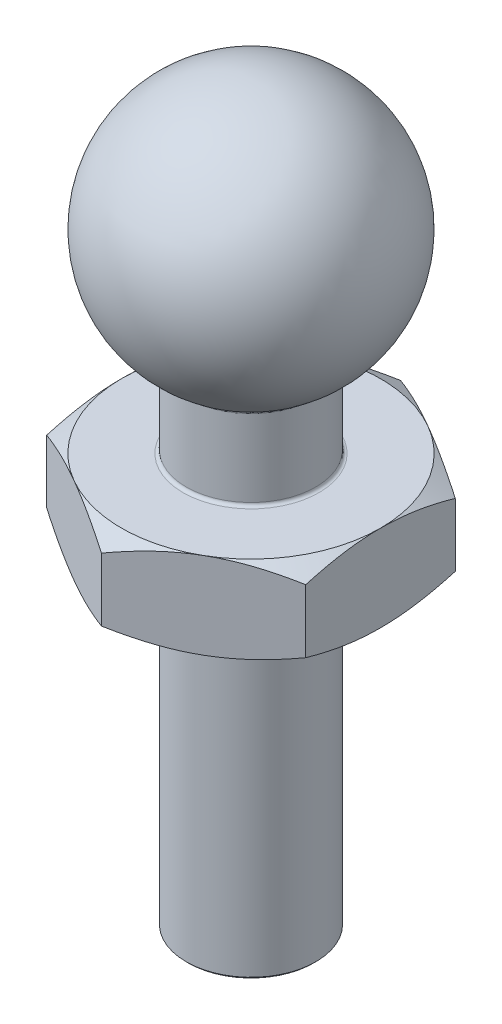
ISO-10303-21;
HEADER;
FILE_DESCRIPTION(('STEP AP214'),'2;1');
FILE_NAME('part.step','',(''),(''),'','','');
FILE_SCHEMA(('AUTOMOTIVE_DESIGN { 1 0 10303 214 1 1 1 1 }'));
ENDSEC;
DATA;
#1=APPLICATION_CONTEXT('core data for automotive mechanical design processes');
#2=APPLICATION_PROTOCOL_DEFINITION('international standard','automotive_design',2000,#1);
#3=PRODUCT_CONTEXT('',#1,'mechanical');
#4=PRODUCT('Part','Part','',(#3));
#5=PRODUCT_RELATED_PRODUCT_CATEGORY('part','',(#4));
#6=PRODUCT_DEFINITION_FORMATION('','',#4);
#7=PRODUCT_DEFINITION_CONTEXT('part definition',#1,'design');
#8=PRODUCT_DEFINITION('design','',#6,#7);
#9=PRODUCT_DEFINITION_SHAPE('','',#8);
#10=(LENGTH_UNIT() NAMED_UNIT(*) SI_UNIT(.MILLI.,.METRE.));
#11=(NAMED_UNIT(*) PLANE_ANGLE_UNIT() SI_UNIT($,.RADIAN.));
#12=(NAMED_UNIT(*) SI_UNIT($,.STERADIAN.) SOLID_ANGLE_UNIT());
#13=UNCERTAINTY_MEASURE_WITH_UNIT(LENGTH_MEASURE(1.E-05),#10,'distance_accuracy_value','');
#14=(GEOMETRIC_REPRESENTATION_CONTEXT(3) GLOBAL_UNCERTAINTY_ASSIGNED_CONTEXT((#13)) GLOBAL_UNIT_ASSIGNED_CONTEXT((#10,
#11,#12)) REPRESENTATION_CONTEXT('',''));
#15=CARTESIAN_POINT('',(0.,0.,0.));
#16=DIRECTION('',(0.,0.,1.));
#17=DIRECTION('',(1.,0.,0.));
#18=AXIS2_PLACEMENT_3D('',#15,#16,#17);
#19=CARTESIAN_POINT('',(0.,7.5,0.));
#20=DIRECTION('',(0.,1.,0.));
#21=DIRECTION('',(0.,0.,1.));
#22=AXIS2_PLACEMENT_3D('',#19,#20,#21);
#23=PLANE('',#22);
#24=CARTESIAN_POINT('',(0.,7.5,0.));
#25=DIRECTION('',(0.,1.,0.));
#26=DIRECTION('',(0.,0.,1.));
#27=AXIS2_PLACEMENT_3D('',#24,#25,#26);
#28=CIRCLE('',#27,1.5);
#29=CARTESIAN_POINT('',(0.,7.5,1.5));
#30=VERTEX_POINT('',#29);
#31=EDGE_CURVE('E323',#30,#30,#28,.T.);
#32=ORIENTED_EDGE('',*,*,#31,.T.);
#33=EDGE_LOOP('',(#32));
#34=FACE_BOUND('',#33,.T.);
#35=CARTESIAN_POINT('',(0.,7.5,0.));
#36=DIRECTION('',(0.,-1.,0.));
#37=DIRECTION('',(0.,0.,-1.));
#38=AXIS2_PLACEMENT_3D('',#35,#36,#37);
#39=CIRCLE('',#38,3.);
#40=CARTESIAN_POINT('',(3.,7.5,0.));
#41=VERTEX_POINT('',#40);
#42=CARTESIAN_POINT('',(1.5,7.5,2.59807621135332));
#43=VERTEX_POINT('',#42);
#44=EDGE_CURVE('E327',#41,#43,#39,.T.);
#45=ORIENTED_EDGE('',*,*,#44,.T.);
#46=CARTESIAN_POINT('',(-1.5,7.5,2.59807621135332));
#47=VERTEX_POINT('',#46);
#48=EDGE_CURVE('E330',#43,#47,#39,.T.);
#49=ORIENTED_EDGE('',*,*,#48,.T.);
#50=CARTESIAN_POINT('',(-3.,7.5,0.));
#51=VERTEX_POINT('',#50);
#52=EDGE_CURVE('E338',#47,#51,#39,.T.);
#53=ORIENTED_EDGE('',*,*,#52,.T.);
#54=CARTESIAN_POINT('',(-1.5,7.5,-2.59807621135332));
#55=VERTEX_POINT('',#54);
#56=EDGE_CURVE('E340',#51,#55,#39,.T.);
#57=ORIENTED_EDGE('',*,*,#56,.T.);
#58=CARTESIAN_POINT('',(1.5,7.5,-2.59807621135332));
#59=VERTEX_POINT('',#58);
#60=EDGE_CURVE('E337',#55,#59,#39,.T.);
#61=ORIENTED_EDGE('',*,*,#60,.T.);
#62=EDGE_CURVE('E262',#59,#41,#39,.T.);
#63=ORIENTED_EDGE('',*,*,#62,.T.);
#64=EDGE_LOOP('',(#45,#49,#53,#57,#61,#63));
#65=FACE_BOUND('',#64,.T.);
#66=ADVANCED_FACE('F51',(#34,#65),#23,.F.);
#67=CARTESIAN_POINT('',(0.,17.,0.));
#68=DIRECTION('',(0.,1.,0.));
#69=DIRECTION('',(0.,0.,1.));
#70=AXIS2_PLACEMENT_3D('',#67,#68,#69);
#71=CYLINDRICAL_SURFACE('',#70,1.5);
#72=CARTESIAN_POINT('',(0.,0.0500000000000014,0.));
#73=DIRECTION('',(0.,1.,0.));
#74=DIRECTION('',(0.,0.,1.));
#75=AXIS2_PLACEMENT_3D('',#72,#73,#74);
#76=CIRCLE('',#75,1.5);
#77=CARTESIAN_POINT('',(0.,0.0500000000000014,1.5));
#78=VERTEX_POINT('',#77);
#79=EDGE_CURVE('E397',#78,#78,#76,.T.);
#80=ORIENTED_EDGE('',*,*,#79,.T.);
#81=EDGE_LOOP('',(#80));
#82=FACE_BOUND('',#81,.T.);
#83=ORIENTED_EDGE('',*,*,#31,.F.);
#84=EDGE_LOOP('',(#83));
#85=FACE_BOUND('',#84,.T.);
#86=ADVANCED_FACE('F288',(#82,#85),#71,.T.);
#87=CARTESIAN_POINT('',(1.5,0.,0.));
#88=DIRECTION('',(0.,1.,0.));
#89=DIRECTION('',(0.,0.,1.));
#90=AXIS2_PLACEMENT_3D('',#87,#88,#89);
#91=PLANE('',#90);
#92=CARTESIAN_POINT('',(0.,0.,0.));
#93=DIRECTION('',(0.,1.,0.));
#94=DIRECTION('',(0.,0.,1.));
#95=AXIS2_PLACEMENT_3D('',#92,#93,#94);
#96=CIRCLE('',#95,1.45);
#97=CARTESIAN_POINT('',(0.,0.,1.45));
#98=VERTEX_POINT('',#97);
#99=EDGE_CURVE('E401',#98,#98,#96,.F.);
#100=ORIENTED_EDGE('',*,*,#99,.T.);
#101=EDGE_LOOP('',(#100));
#102=FACE_BOUND('',#101,.T.);
#103=ADVANCED_FACE('F289',(#102),#91,.F.);
#104=CARTESIAN_POINT('',(0.,0.0500000000000014,0.));
#105=DIRECTION('',(0.,1.,0.));
#106=DIRECTION('',(0.,0.,1.));
#107=AXIS2_PLACEMENT_3D('',#104,#105,#106);
#108=CONICAL_SURFACE('',#107,1.5,0.785398163397444);
#109=ORIENTED_EDGE('',*,*,#99,.F.);
#110=EDGE_LOOP('',(#109));
#111=FACE_BOUND('',#110,.T.);
#112=ORIENTED_EDGE('',*,*,#79,.F.);
#113=EDGE_LOOP('',(#112));
#114=FACE_BOUND('',#113,.T.);
#115=ADVANCED_FACE('F292',(#111,#114),#108,.T.);
#116=CARTESIAN_POINT('',(0.,7.5,0.));
#117=DIRECTION('',(0.,1.,0.));
#118=DIRECTION('',(0.,0.,-1.));
#119=AXIS2_PLACEMENT_3D('',#116,#117,#118);
#120=CONICAL_SURFACE('',#119,3.,1.0471975511966);
#121=CARTESIAN_POINT('',(0.000200000000000398,7.76801586243101,3.46421708519159));
#122=CARTESIAN_POINT('',(-0.131635206588331,7.72405370445231,3.38810199317915));
#123=CARTESIAN_POINT('',(-0.264608405355249,7.68407158629263,3.31132988107606));
#124=CARTESIAN_POINT('',(-0.532857420002055,7.61428208044547,3.15645624025988));
#125=CARTESIAN_POINT('',(-0.668138002634341,7.58449938226538,3.078351959461));
#126=CARTESIAN_POINT('',(-0.937022602096483,7.53813783921126,2.92311136358059));
#127=CARTESIAN_POINT('',(-1.07058524542946,7.52125044112295,2.84599893549861));
#128=CARTESIAN_POINT('',(-1.33833905729569,7.50108964244852,2.6914112001411));
#129=CARTESIAN_POINT('',(-1.47252925247984,7.49779954778108,2.61393645482892));
#130=CARTESIAN_POINT('',(-1.72327559769581,7.50464053088539,2.46916798492017));
#131=CARTESIAN_POINT('',(-1.83986926497268,7.51309191419262,2.40185259973206));
#132=CARTESIAN_POINT('',(-2.07229698497464,7.53987894300704,2.2676603930218));
#133=CARTESIAN_POINT('',(-2.18813023365133,7.55822374086171,2.2007840357172));
#134=CARTESIAN_POINT('',(-2.42103725705637,7.60408475085333,2.06631510305815));
#135=CARTESIAN_POINT('',(-2.53808155051394,7.63179538526308,1.99873954872331));
#136=CARTESIAN_POINT('',(-2.77042435049912,7.6946877951374,1.86459637060759));
#137=CARTESIAN_POINT('',(-2.88572583417111,7.72985479102156,1.79802702797161));
#138=CARTESIAN_POINT('',(-3.0002,7.76801586243101,1.73193533751504));
#139=B_SPLINE_CURVE_WITH_KNOTS('',3,(#121,#122,#123,#124,#125,#126,#127,#128,#129,#130,#131,
#132,#133,#134,#135,#136,#137,#138),.UNSPECIFIED.,.F.,.F.,(4,2,2,2,2,2,2,2,4),(0.,
0.475539830103041,0.952222784107964,1.41710776961288,1.88142182298026,2.28572436316091,
2.69040156475039,3.10405572063576,3.5168974940707),.UNSPECIFIED.);
#140=CARTESIAN_POINT('',(0.,7.76794919243112,3.46410161513776));
#141=VERTEX_POINT('',#140);
#142=EDGE_CURVE('E253',#141,#47,#139,.T.);
#143=ORIENTED_EDGE('',*,*,#142,.T.);
#144=ORIENTED_EDGE('',*,*,#48,.F.);
#145=CARTESIAN_POINT('',(3.0002,7.76801586243101,1.73193533751504));
#146=CARTESIAN_POINT('',(2.86836479341167,7.72405370445231,1.80805042952748));
#147=CARTESIAN_POINT('',(2.73539159464475,7.68407158629263,1.88482254163057));
#148=CARTESIAN_POINT('',(2.46714257999794,7.61428208044547,2.03969618244675));
#149=CARTESIAN_POINT('',(2.33186199736566,7.58449938226538,2.11780046324563));
#150=CARTESIAN_POINT('',(2.06297739790352,7.53813783921126,2.27304105912605));
#151=CARTESIAN_POINT('',(1.92941475457054,7.52125044112295,2.35015348720802));
#152=CARTESIAN_POINT('',(1.66166094270431,7.50108964244852,2.50474122256554));
#153=CARTESIAN_POINT('',(1.52747074752016,7.49779954778108,2.58221596787771));
#154=CARTESIAN_POINT('',(1.27672440230419,7.50464053088539,2.72698443778647));
#155=CARTESIAN_POINT('',(1.16013073502732,7.51309191419262,2.79429982297457));
#156=CARTESIAN_POINT('',(0.927703015025364,7.53987894300704,2.92849202968483));
#157=CARTESIAN_POINT('',(0.81186976634867,7.55822374086171,2.99536838698943));
#158=CARTESIAN_POINT('',(0.578962742943633,7.60408475085333,3.12983731964849));
#159=CARTESIAN_POINT('',(0.46191844948606,7.63179538526308,3.19741287398332));
#160=CARTESIAN_POINT('',(0.229575649500875,7.6946877951374,3.33155605209904));
#161=CARTESIAN_POINT('',(0.114274165828894,7.72985479102156,3.39812539473502));
#162=CARTESIAN_POINT('',(-0.000199999999999877,7.76801586243101,3.46421708519159));
#163=B_SPLINE_CURVE_WITH_KNOTS('',3,(#145,#146,#147,#148,#149,#150,#151,#152,#153,#154,#155,
#156,#157,#158,#159,#160,#161,#162),.UNSPECIFIED.,.F.,.F.,(4,2,2,2,2,2,2,2,4),(0.,
0.47553983010304,0.952222784107964,1.41710776961288,1.88142182298026,2.28572436316091,
2.69040156475039,3.10405572063576,3.5168974940707),.UNSPECIFIED.);
#164=EDGE_CURVE('E404',#43,#141,#163,.T.);
#165=ORIENTED_EDGE('',*,*,#164,.T.);
#166=EDGE_LOOP('',(#143,#144,#165));
#167=FACE_BOUND('',#166,.T.);
#168=ADVANCED_FACE('F301',(#167),#120,.T.);
#169=CARTESIAN_POINT('',(3.,9.50330724402733,-5.73225080756888));
#170=CARTESIAN_POINT('',(3.,9.43464237126105,-5.59799811373669));
#171=CARTESIAN_POINT('',(3.,9.36637341925044,-5.46354106552017));
#172=CARTESIAN_POINT('',(3.,9.2308248022497,-5.19412594711895));
#173=CARTESIAN_POINT('',(3.,9.16354515832403,-5.05916786634262));
#174=CARTESIAN_POINT('',(3.,9.03006127591258,-4.78843231789163));
#175=CARTESIAN_POINT('',(3.,8.9638590776609,-4.65265384244874));
#176=CARTESIAN_POINT('',(3.,8.83291944474628,-4.38038885038151));
#177=CARTESIAN_POINT('',(3.,8.76818203148001,-4.24390232345014));
#178=CARTESIAN_POINT('',(3.,8.63726924760924,-3.96310511366176));
#179=CARTESIAN_POINT('',(3.,8.57118867268844,-3.81875010473635));
#180=CARTESIAN_POINT('',(3.,8.44157071272035,-3.52890389215656));
#181=CARTESIAN_POINT('',(3.,8.37803325458598,-3.38341272129836));
#182=CARTESIAN_POINT('',(3.,8.25426481523107,-3.09114280320249));
#183=CARTESIAN_POINT('',(3.,8.19403155172058,-2.94436502804428));
#184=CARTESIAN_POINT('',(3.,8.07778705413149,-2.64909731827644));
#185=CARTESIAN_POINT('',(3.,8.02177685319141,-2.50060697487877));
#186=CARTESIAN_POINT('',(3.,7.90579651393534,-2.17495473766773));
#187=CARTESIAN_POINT('',(3.,7.84690225188754,-1.99740334689548));
#188=CARTESIAN_POINT('',(3.,7.73970476580994,-1.63917764376158));
#189=CARTESIAN_POINT('',(3.,7.69139595385541,-1.45850503366086));
#190=CARTESIAN_POINT('',(3.,7.60976736720391,-1.09720914532956));
#191=CARTESIAN_POINT('',(3.,7.57618522306302,-0.916647599895755));
#192=CARTESIAN_POINT('',(3.,7.53873257823308,-0.644079261802785));
#193=CARTESIAN_POINT('',(3.,7.52840212622122,-0.552943422867092));
#194=CARTESIAN_POINT('',(3.,7.51236545399948,-0.370270654947725));
#195=CARTESIAN_POINT('',(3.,7.50665855920199,-0.278733786435307));
#196=CARTESIAN_POINT('',(3.,7.50003385145738,-0.0944078517722065));
#197=CARTESIAN_POINT('',(3.,7.49917313836561,-0.00161671746075821));
#198=CARTESIAN_POINT('',(3.,7.50242474437203,0.183877598413802));
#199=CARTESIAN_POINT('',(3.,7.50653707980771,0.27658077968697));
#200=CARTESIAN_POINT('',(3.,7.51958629232832,0.461668088480516));
#201=CARTESIAN_POINT('',(3.,7.52852441288393,0.554052127589445));
#202=CARTESIAN_POINT('',(3.,7.5509180164693,0.738276464049775));
#203=CARTESIAN_POINT('',(3.,7.56437421254375,0.830116673244045));
#204=CARTESIAN_POINT('',(3.,7.61151321654347,1.1081241349506));
#205=CARTESIAN_POINT('',(3.,7.65168916483078,1.29320289274649));
#206=CARTESIAN_POINT('',(3.,7.74516695908608,1.65992833453579));
#207=CARTESIAN_POINT('',(3.,7.7984718251831,1.8415742184766));
#208=CARTESIAN_POINT('',(3.,7.90998517829698,2.18718321983853));
#209=CARTESIAN_POINT('',(3.,7.96745039113262,2.35139002090274));
#210=CARTESIAN_POINT('',(3.,8.08842229406423,2.67757637701536));
#211=CARTESIAN_POINT('',(3.,8.15193017789617,2.83955548471668));
#212=CARTESIAN_POINT('',(3.,8.28350331004152,3.16180541641892));
#213=CARTESIAN_POINT('',(3.,8.35157253601678,3.32207460435457));
#214=CARTESIAN_POINT('',(3.,8.49111835327863,3.64112437712565));
#215=CARTESIAN_POINT('',(3.,8.56259510919257,3.79990488959462));
#216=CARTESIAN_POINT('',(3.,8.70427958485193,4.10783154121877));
#217=CARTESIAN_POINT('',(3.,8.77435195699988,4.25704019529893));
#218=CARTESIAN_POINT('',(3.,8.9163448127077,4.55457880885657));
#219=CARTESIAN_POINT('',(3.,8.98826534808616,4.70290874355283));
#220=CARTESIAN_POINT('',(3.,9.1333691427572,4.99841900754648));
#221=CARTESIAN_POINT('',(3.,9.20654817764491,5.14560141584992));
#222=CARTESIAN_POINT('',(3.,9.35409847057374,5.43935321353677));
#223=CARTESIAN_POINT('',(3.,9.42846963344796,5.58592265068707));
#224=CARTESIAN_POINT('',(3.,9.50330724402733,5.73225080756888));
#225=B_SPLINE_CURVE_WITH_KNOTS('',3,(#169,#170,#171,#172,#173,#174,#175,#176,#177,#178,#179,
#180,#181,#182,#183,#184,#185,#186,#187,#188,#189,#190,#191,#192,#193,#194,#195,#196,#197,#198,
#199,#200,#201,#202,#203,#204,#205,#206,#207,#208,#209,#210,#211,#212,#213,#214,#215,#216,#217,
#218,#219,#220,#221,#222,#223,#224),.UNSPECIFIED.,.F.,.F.,(4,2,2,2,2,2,2,2,2,2,2,2,2,2,2,2,2,2,
2,2,2,2,2,2,2,2,2,4),(0.,0.452382016001321,0.904773650265349,1.35794045354517,1.81111387213612,
2.2873771437625,2.76362671813268,3.23954308217786,3.71557550010852,4.27652369616462,
4.83717505756687,5.38738613645124,5.66244417939779,5.937462083513,6.21571369559986,
6.4939662218021,6.77229048018743,7.05065868449287,7.61810965270507,8.18569127741243,
8.70745206667821,9.2293161451901,9.75164138486645,10.2739918851653,10.7685068932809,
11.2630357817083,11.756143015984,12.2492110799155),.UNSPECIFIED.);
#226=CARTESIAN_POINT('',(3.,7.76794919243112,1.73205080756888));
#227=VERTEX_POINT('',#226);
#228=EDGE_CURVE('E261',#41,#227,#225,.T.);
#229=ORIENTED_EDGE('',*,*,#228,.T.);
#230=EDGE_CURVE('E411',#227,#43,#163,.T.);
#231=ORIENTED_EDGE('',*,*,#230,.T.);
#232=ORIENTED_EDGE('',*,*,#44,.F.);
#233=EDGE_LOOP('',(#229,#231,#232));
#234=FACE_BOUND('',#233,.T.);
#235=ADVANCED_FACE('F501',(#234),#120,.T.);
#236=CARTESIAN_POINT('',(-3.,9.50330724402733,5.73225080756888));
#237=CARTESIAN_POINT('',(-3.,9.43464237126105,5.59799811373669));
#238=CARTESIAN_POINT('',(-3.,9.36637341925044,5.46354106552017));
#239=CARTESIAN_POINT('',(-3.,9.2308248022497,5.19412594711895));
#240=CARTESIAN_POINT('',(-3.,9.16354515832403,5.05916786634262));
#241=CARTESIAN_POINT('',(-3.,9.03006127591258,4.78843231789163));
#242=CARTESIAN_POINT('',(-3.,8.9638590776609,4.65265384244874));
#243=CARTESIAN_POINT('',(-3.,8.83291944474628,4.38038885038151));
#244=CARTESIAN_POINT('',(-3.,8.76818203148001,4.24390232345014));
#245=CARTESIAN_POINT('',(-3.,8.63726924760924,3.96310511366176));
#246=CARTESIAN_POINT('',(-3.,8.57118867268844,3.81875010473635));
#247=CARTESIAN_POINT('',(-3.,8.44157071272035,3.52890389215656));
#248=CARTESIAN_POINT('',(-3.,8.37803325458598,3.38341272129836));
#249=CARTESIAN_POINT('',(-3.,8.25426481523107,3.0911428032025));
#250=CARTESIAN_POINT('',(-3.,8.19403155172058,2.94436502804428));
#251=CARTESIAN_POINT('',(-3.,8.07778705413149,2.64909731827644));
#252=CARTESIAN_POINT('',(-3.,8.02177685319141,2.50060697487877));
#253=CARTESIAN_POINT('',(-3.,7.90579651393534,2.17495473766773));
#254=CARTESIAN_POINT('',(-3.,7.84690225188754,1.99740334689548));
#255=CARTESIAN_POINT('',(-3.,7.73970476580994,1.63917764376158));
#256=CARTESIAN_POINT('',(-3.,7.69139595385541,1.45850503366086));
#257=CARTESIAN_POINT('',(-3.,7.60976736720391,1.09720914532956));
#258=CARTESIAN_POINT('',(-3.,7.57618522306302,0.916647599895757));
#259=CARTESIAN_POINT('',(-3.,7.53873257823308,0.644079261802787));
#260=CARTESIAN_POINT('',(-3.,7.52840212622122,0.552943422867095));
#261=CARTESIAN_POINT('',(-3.,7.51236545399948,0.370270654947728));
#262=CARTESIAN_POINT('',(-3.,7.50665855920199,0.27873378643531));
#263=CARTESIAN_POINT('',(-3.,7.50003385145738,0.0944078517722089));
#264=CARTESIAN_POINT('',(-3.,7.4991731383656,0.0016167174607605));
#265=CARTESIAN_POINT('',(-3.,7.50242474437203,-0.1838775984138));
#266=CARTESIAN_POINT('',(-3.,7.50653707980771,-0.276580779686967));
#267=CARTESIAN_POINT('',(-3.,7.51958629232832,-0.461668088480514));
#268=CARTESIAN_POINT('',(-3.,7.52852441288393,-0.554052127589442));
#269=CARTESIAN_POINT('',(-3.,7.5509180164693,-0.738276464049773));
#270=CARTESIAN_POINT('',(-3.,7.56437421254374,-0.830116673244042));
#271=CARTESIAN_POINT('',(-3.,7.61151321654347,-1.1081241349506));
#272=CARTESIAN_POINT('',(-3.,7.65168916483078,-1.29320289274649));
#273=CARTESIAN_POINT('',(-3.,7.74516695908608,-1.65992833453579));
#274=CARTESIAN_POINT('',(-3.,7.79847182518309,-1.8415742184766));
#275=CARTESIAN_POINT('',(-3.,7.90998517829698,-2.18718321983853));
#276=CARTESIAN_POINT('',(-3.,7.96745039113261,-2.35139002090273));
#277=CARTESIAN_POINT('',(-3.,8.08842229406423,-2.67757637701535));
#278=CARTESIAN_POINT('',(-3.,8.15193017789617,-2.83955548471668));
#279=CARTESIAN_POINT('',(-3.,8.28350331004152,-3.16180541641892));
#280=CARTESIAN_POINT('',(-3.,8.35157253601677,-3.32207460435457));
#281=CARTESIAN_POINT('',(-3.,8.49111835327863,-3.64112437712565));
#282=CARTESIAN_POINT('',(-3.,8.56259510919257,-3.79990488959461));
#283=CARTESIAN_POINT('',(-3.,8.70427958485193,-4.10783154121876));
#284=CARTESIAN_POINT('',(-3.,8.77435195699987,-4.25704019529893));
#285=CARTESIAN_POINT('',(-3.,8.9163448127077,-4.55457880885657));
#286=CARTESIAN_POINT('',(-3.,8.98826534808615,-4.70290874355283));
#287=CARTESIAN_POINT('',(-3.,9.13336914275719,-4.99841900754647));
#288=CARTESIAN_POINT('',(-3.,9.20654817764491,-5.14560141584992));
#289=CARTESIAN_POINT('',(-3.,9.35409847057374,-5.43935321353677));
#290=CARTESIAN_POINT('',(-3.,9.42846963344796,-5.58592265068707));
#291=CARTESIAN_POINT('',(-3.,9.50330724402733,-5.73225080756888));
#292=B_SPLINE_CURVE_WITH_KNOTS('',3,(#236,#237,#238,#239,#240,#241,#242,#243,#244,#245,#246,
#247,#248,#249,#250,#251,#252,#253,#254,#255,#256,#257,#258,#259,#260,#261,#262,#263,#264,#265,
#266,#267,#268,#269,#270,#271,#272,#273,#274,#275,#276,#277,#278,#279,#280,#281,#282,#283,#284,
#285,#286,#287,#288,#289,#290,#291),.UNSPECIFIED.,.F.,.F.,(4,2,2,2,2,2,2,2,2,2,2,2,2,2,2,2,2,2,
2,2,2,2,2,2,2,2,2,4),(0.,0.452382016001322,0.90477365026535,1.35794045354517,1.81111387213612,
2.2873771437625,2.76362671813267,3.23954308217786,3.71557550010852,4.27652369616461,
4.83717505756687,5.38738613645124,5.66244417939778,5.937462083513,6.21571369559986,
6.4939662218021,6.77229048018743,7.05065868449287,7.61810965270507,8.18569127741243,
8.70745206667821,9.22931614519009,9.75164138486645,10.2739918851653,10.7685068932809,
11.2630357817083,11.756143015984,12.2492110799155),.UNSPECIFIED.);
#293=CARTESIAN_POINT('',(-3.,7.76794919243112,1.73205080756888));
#294=VERTEX_POINT('',#293);
#295=EDGE_CURVE('E272',#294,#51,#292,.T.);
#296=ORIENTED_EDGE('',*,*,#295,.T.);
#297=ORIENTED_EDGE('',*,*,#52,.F.);
#298=EDGE_CURVE('E263',#47,#294,#139,.T.);
#299=ORIENTED_EDGE('',*,*,#298,.T.);
#300=EDGE_LOOP('',(#296,#297,#299));
#301=FACE_BOUND('',#300,.T.);
#302=ADVANCED_FACE('F483',(#301),#120,.T.);
#303=CARTESIAN_POINT('',(-3.0002,7.76801586243101,-1.73193533751504));
#304=CARTESIAN_POINT('',(-2.86836479341167,7.7240537044523,-1.80805042952748));
#305=CARTESIAN_POINT('',(-2.73539159464475,7.68407158629263,-1.88482254163057));
#306=CARTESIAN_POINT('',(-2.46714257999794,7.61428208044546,-2.03969618244675));
#307=CARTESIAN_POINT('',(-2.33186199736566,7.58449938226538,-2.11780046324563));
#308=CARTESIAN_POINT('',(-2.06297739790352,7.53813783921126,-2.27304105912605));
#309=CARTESIAN_POINT('',(-1.92941475457054,7.52125044112295,-2.35015348720802));
#310=CARTESIAN_POINT('',(-1.66166094270431,7.50108964244852,-2.50474122256553));
#311=CARTESIAN_POINT('',(-1.52747074752016,7.49779954778108,-2.58221596787771));
#312=CARTESIAN_POINT('',(-1.27672440230419,7.50464053088539,-2.72698443778646));
#313=CARTESIAN_POINT('',(-1.16013073502732,7.51309191419262,-2.79429982297457));
#314=CARTESIAN_POINT('',(-0.927703015025363,7.53987894300703,-2.92849202968483));
#315=CARTESIAN_POINT('',(-0.811869766348669,7.55822374086171,-2.99536838698943));
#316=CARTESIAN_POINT('',(-0.578962742943632,7.60408475085333,-3.12983731964848));
#317=CARTESIAN_POINT('',(-0.461918449486059,7.63179538526308,-3.19741287398332));
#318=CARTESIAN_POINT('',(-0.229575649500874,7.6946877951374,-3.33155605209904));
#319=CARTESIAN_POINT('',(-0.114274165828893,7.72985479102156,-3.39812539473502));
#320=CARTESIAN_POINT('',(0.000200000000001287,7.76801586243101,-3.46421708519159));
#321=B_SPLINE_CURVE_WITH_KNOTS('',3,(#303,#304,#305,#306,#307,#308,#309,#310,#311,#312,#313,
#314,#315,#316,#317,#318,#319,#320),.UNSPECIFIED.,.F.,.F.,(4,2,2,2,2,2,2,2,4),(0.,
0.475539830103041,0.952222784107964,1.41710776961288,1.88142182298026,2.28572436316091,
2.69040156475039,3.10405572063576,3.5168974940707),.UNSPECIFIED.);
#322=CARTESIAN_POINT('',(-3.,7.7679491924311,-1.73205080756891));
#323=VERTEX_POINT('',#322);
#324=EDGE_CURVE('E381',#323,#55,#321,.T.);
#325=ORIENTED_EDGE('',*,*,#324,.T.);
#326=ORIENTED_EDGE('',*,*,#56,.F.);
#327=EDGE_CURVE('E443',#51,#323,#292,.T.);
#328=ORIENTED_EDGE('',*,*,#327,.T.);
#329=EDGE_LOOP('',(#325,#326,#328));
#330=FACE_BOUND('',#329,.T.);
#331=ADVANCED_FACE('F201',(#330),#120,.T.);
#332=CARTESIAN_POINT('',(0.,7.76794919243112,-3.46410161513775));
#333=VERTEX_POINT('',#332);
#334=EDGE_CURVE('E450',#55,#333,#321,.T.);
#335=ORIENTED_EDGE('',*,*,#334,.T.);
#336=CARTESIAN_POINT('',(-0.00019999999999887,7.76801586243101,-3.46421708519159));
#337=CARTESIAN_POINT('',(0.131635206588333,7.7240537044523,-3.38810199317915));
#338=CARTESIAN_POINT('',(0.26460840535525,7.68407158629263,-3.31132988107606));
#339=CARTESIAN_POINT('',(0.532857420002057,7.61428208044547,-3.15645624025988));
#340=CARTESIAN_POINT('',(0.668138002634342,7.58449938226538,-3.078351959461));
#341=CARTESIAN_POINT('',(0.937022602096484,7.53813783921126,-2.92311136358059));
#342=CARTESIAN_POINT('',(1.07058524542946,7.52125044112295,-2.84599893549861));
#343=CARTESIAN_POINT('',(1.33833905729569,7.50108964244852,-2.6914112001411));
#344=CARTESIAN_POINT('',(1.47252925247984,7.49779954778108,-2.61393645482892));
#345=CARTESIAN_POINT('',(1.72327559769581,7.50464053088539,-2.46916798492017));
#346=CARTESIAN_POINT('',(1.83986926497268,7.51309191419262,-2.40185259973206));
#347=CARTESIAN_POINT('',(2.07229698497464,7.53987894300703,-2.2676603930218));
#348=CARTESIAN_POINT('',(2.18813023365133,7.55822374086171,-2.2007840357172));
#349=CARTESIAN_POINT('',(2.42103725705637,7.60408475085333,-2.06631510305815));
#350=CARTESIAN_POINT('',(2.53808155051394,7.63179538526308,-1.99873954872331));
#351=CARTESIAN_POINT('',(2.77042435049913,7.6946877951374,-1.86459637060759));
#352=CARTESIAN_POINT('',(2.88572583417111,7.72985479102156,-1.79802702797161));
#353=CARTESIAN_POINT('',(3.0002,7.76801586243101,-1.73193533751504));
#354=B_SPLINE_CURVE_WITH_KNOTS('',3,(#336,#337,#338,#339,#340,#341,#342,#343,#344,#345,#346,
#347,#348,#349,#350,#351,#352,#353),.UNSPECIFIED.,.F.,.F.,(4,2,2,2,2,2,2,2,4),(0.,
0.475539830103041,0.952222784107964,1.41710776961288,1.88142182298026,2.28572436316091,
2.69040156475039,3.10405572063576,3.5168974940707),.UNSPECIFIED.);
#355=EDGE_CURVE('E440',#333,#59,#354,.T.);
#356=ORIENTED_EDGE('',*,*,#355,.T.);
#357=ORIENTED_EDGE('',*,*,#60,.F.);
#358=EDGE_LOOP('',(#335,#356,#357));
#359=FACE_BOUND('',#358,.T.);
#360=ADVANCED_FACE('F482',(#359),#120,.T.);
#361=CARTESIAN_POINT('',(3.,7.76794919243112,-1.73205080756888));
#362=VERTEX_POINT('',#361);
#363=EDGE_CURVE('E435',#59,#362,#354,.T.);
#364=ORIENTED_EDGE('',*,*,#363,.T.);
#365=EDGE_CURVE('E271',#362,#41,#225,.T.);
#366=ORIENTED_EDGE('',*,*,#365,.T.);
#367=ORIENTED_EDGE('',*,*,#62,.F.);
#368=EDGE_LOOP('',(#364,#366,#367));
#369=FACE_BOUND('',#368,.T.);
#370=ADVANCED_FACE('F437',(#369),#120,.T.);
#371=CARTESIAN_POINT('',(0.,9.5,3.46410161513776));
#372=DIRECTION('',(-0.5,0.,-0.866025403784439));
#373=DIRECTION('',(-0.866025403784439,0.,0.5));
#374=AXIS2_PLACEMENT_3D('',#371,#372,#373);
#375=PLANE('',#374);
#376=DIRECTION('',(0.,-1.,0.));
#377=VECTOR('',#376,1.);
#378=CARTESIAN_POINT('',(3.,9.5,1.73205080756888));
#379=LINE('',#378,#377);
#380=CARTESIAN_POINT('',(3.,9.23205080756888,1.73205080756888));
#381=VERTEX_POINT('',#380);
#382=EDGE_CURVE('E457',#381,#227,#379,.T.);
#383=ORIENTED_EDGE('',*,*,#382,.F.);
#384=CARTESIAN_POINT('',(3.0002,9.23198413756899,1.73193533751504));
#385=CARTESIAN_POINT('',(2.86836479341167,9.27594629554769,1.80805042952748));
#386=CARTESIAN_POINT('',(2.73539159464475,9.31592841370737,1.88482254163057));
#387=CARTESIAN_POINT('',(2.46714257999794,9.38571791955454,2.03969618244675));
#388=CARTESIAN_POINT('',(2.33186199736566,9.41550061773462,2.11780046324563));
#389=CARTESIAN_POINT('',(2.06297739790352,9.46186216078875,2.27304105912605));
#390=CARTESIAN_POINT('',(1.92941475457054,9.47874955887705,2.35015348720802));
#391=CARTESIAN_POINT('',(1.66166094270431,9.49891035755148,2.50474122256554));
#392=CARTESIAN_POINT('',(1.52747074752016,9.50220045221892,2.58221596787771));
#393=CARTESIAN_POINT('',(1.27672440230419,9.49535946911461,2.72698443778647));
#394=CARTESIAN_POINT('',(1.16013073502732,9.48690808580738,2.79429982297457));
#395=CARTESIAN_POINT('',(0.927703015025364,9.46012105699297,2.92849202968483));
#396=CARTESIAN_POINT('',(0.811869766348669,9.44177625913829,2.99536838698943));
#397=CARTESIAN_POINT('',(0.578962742943633,9.39591524914667,3.12983731964849));
#398=CARTESIAN_POINT('',(0.46191844948606,9.36820461473692,3.19741287398332));
#399=CARTESIAN_POINT('',(0.229575649500876,9.3053122048626,3.33155605209904));
#400=CARTESIAN_POINT('',(0.114274165828894,9.27014520897845,3.39812539473502));
#401=CARTESIAN_POINT('',(-0.000199999999999755,9.23198413756899,3.46421708519159));
#402=B_SPLINE_CURVE_WITH_KNOTS('',3,(#384,#385,#386,#387,#388,#389,#390,#391,#392,#393,#394,
#395,#396,#397,#398,#399,#400,#401),.UNSPECIFIED.,.F.,.F.,(4,2,2,2,2,2,2,2,4),(0.,
0.475539830103041,0.952222784107964,1.41710776961288,1.88142182298026,2.28572436316091,
2.69040156475039,3.10405572063576,3.5168974940707),.UNSPECIFIED.);
#403=CARTESIAN_POINT('',(1.5,9.5,2.59807621135332));
#404=VERTEX_POINT('',#403);
#405=EDGE_CURVE('E67',#381,#404,#402,.T.);
#406=ORIENTED_EDGE('',*,*,#405,.T.);
#407=CARTESIAN_POINT('',(0.,9.23205080756888,3.46410161513776));
#408=VERTEX_POINT('',#407);
#409=EDGE_CURVE('E235',#404,#408,#402,.T.);
#410=ORIENTED_EDGE('',*,*,#409,.T.);
#411=DIRECTION('',(0.,-1.,0.));
#412=VECTOR('',#411,1.);
#413=CARTESIAN_POINT('',(0.,9.5,3.46410161513776));
#414=LINE('',#413,#412);
#415=EDGE_CURVE('E353',#408,#141,#414,.T.);
#416=ORIENTED_EDGE('',*,*,#415,.T.);
#417=ORIENTED_EDGE('',*,*,#164,.F.);
#418=ORIENTED_EDGE('',*,*,#230,.F.);
#419=EDGE_LOOP('',(#383,#406,#410,#416,#417,#418));
#420=FACE_BOUND('',#419,.T.);
#421=ADVANCED_FACE('F246',(#420),#375,.F.);
#422=CARTESIAN_POINT('',(-3.,9.5,1.73205080756888));
#423=DIRECTION('',(0.5,0.,-0.866025403784439));
#424=DIRECTION('',(-0.866025403784439,0.,-0.5));
#425=AXIS2_PLACEMENT_3D('',#422,#423,#424);
#426=PLANE('',#425);
#427=ORIENTED_EDGE('',*,*,#415,.F.);
#428=CARTESIAN_POINT('',(0.000200000000000398,9.23198413756899,3.46421708519159));
#429=CARTESIAN_POINT('',(-0.131635206588331,9.27594629554769,3.38810199317915));
#430=CARTESIAN_POINT('',(-0.264608405355248,9.31592841370737,3.31132988107606));
#431=CARTESIAN_POINT('',(-0.532857420002055,9.38571791955454,3.15645624025988));
#432=CARTESIAN_POINT('',(-0.668138002634341,9.41550061773462,3.078351959461));
#433=CARTESIAN_POINT('',(-0.937022602096482,9.46186216078875,2.92311136358059));
#434=CARTESIAN_POINT('',(-1.07058524542946,9.47874955887705,2.84599893549861));
#435=CARTESIAN_POINT('',(-1.33833905729569,9.49891035755148,2.6914112001411));
#436=CARTESIAN_POINT('',(-1.47252925247984,9.50220045221892,2.61393645482892));
#437=CARTESIAN_POINT('',(-1.72327559769581,9.49535946911461,2.46916798492017));
#438=CARTESIAN_POINT('',(-1.83986926497267,9.48690808580738,2.40185259973206));
#439=CARTESIAN_POINT('',(-2.07229698497464,9.46012105699296,2.2676603930218));
#440=CARTESIAN_POINT('',(-2.18813023365133,9.44177625913829,2.2007840357172));
#441=CARTESIAN_POINT('',(-2.42103725705637,9.39591524914667,2.06631510305815));
#442=CARTESIAN_POINT('',(-2.53808155051394,9.36820461473692,1.99873954872331));
#443=CARTESIAN_POINT('',(-2.77042435049913,9.3053122048626,1.86459637060759));
#444=CARTESIAN_POINT('',(-2.88572583417111,9.27014520897845,1.79802702797161));
#445=CARTESIAN_POINT('',(-3.0002,9.23198413756899,1.73193533751504));
#446=B_SPLINE_CURVE_WITH_KNOTS('',3,(#428,#429,#430,#431,#432,#433,#434,#435,#436,#437,#438,
#439,#440,#441,#442,#443,#444,#445),.UNSPECIFIED.,.F.,.F.,(4,2,2,2,2,2,2,2,4),(0.,
0.47553983010304,0.952222784107964,1.41710776961288,1.88142182298026,2.28572436316091,
2.69040156475039,3.10405572063576,3.5168974940707),.UNSPECIFIED.);
#447=CARTESIAN_POINT('',(-1.5,9.5,2.59807621135332));
#448=VERTEX_POINT('',#447);
#449=EDGE_CURVE('E233',#408,#448,#446,.T.);
#450=ORIENTED_EDGE('',*,*,#449,.T.);
#451=CARTESIAN_POINT('',(-3.,9.23205080756888,1.73205080756888));
#452=VERTEX_POINT('',#451);
#453=EDGE_CURVE('E225',#448,#452,#446,.T.);
#454=ORIENTED_EDGE('',*,*,#453,.T.);
#455=DIRECTION('',(0.,-1.,0.));
#456=VECTOR('',#455,1.);
#457=CARTESIAN_POINT('',(-3.,9.5,1.73205080756888));
#458=LINE('',#457,#456);
#459=EDGE_CURVE('E370',#452,#294,#458,.T.);
#460=ORIENTED_EDGE('',*,*,#459,.T.);
#461=ORIENTED_EDGE('',*,*,#298,.F.);
#462=ORIENTED_EDGE('',*,*,#142,.F.);
#463=EDGE_LOOP('',(#427,#450,#454,#460,#461,#462));
#464=FACE_BOUND('',#463,.T.);
#465=ADVANCED_FACE('F242',(#464),#426,.F.);
#466=CARTESIAN_POINT('',(-3.,9.5,-1.73205080756888));
#467=DIRECTION('',(1.,0.,0.));
#468=DIRECTION('',(0.,0.,-1.));
#469=AXIS2_PLACEMENT_3D('',#466,#467,#468);
#470=PLANE('',#469);
#471=ORIENTED_EDGE('',*,*,#459,.F.);
#472=CARTESIAN_POINT('',(-3.,7.49669275597267,5.73225080756888));
#473=CARTESIAN_POINT('',(-3.,7.56535762873895,5.59799811373669));
#474=CARTESIAN_POINT('',(-3.,7.63362658074956,5.46354106552017));
#475=CARTESIAN_POINT('',(-3.,7.76917519775031,5.19412594711895));
#476=CARTESIAN_POINT('',(-3.,7.83645484167597,5.05916786634262));
#477=CARTESIAN_POINT('',(-3.,7.96993872408742,4.78843231789163));
#478=CARTESIAN_POINT('',(-3.,8.0361409223391,4.65265384244874));
#479=CARTESIAN_POINT('',(-3.,8.16708055525372,4.38038885038151));
#480=CARTESIAN_POINT('',(-3.,8.23181796851999,4.24390232345014));
#481=CARTESIAN_POINT('',(-3.,8.36273075239076,3.96310511366176));
#482=CARTESIAN_POINT('',(-3.,8.42881132731156,3.81875010473635));
#483=CARTESIAN_POINT('',(-3.,8.55842928727965,3.52890389215656));
#484=CARTESIAN_POINT('',(-3.,8.62196674541402,3.38341272129836));
#485=CARTESIAN_POINT('',(-3.,8.74573518476893,3.0911428032025));
#486=CARTESIAN_POINT('',(-3.,8.80596844827942,2.94436502804428));
#487=CARTESIAN_POINT('',(-3.,8.92221294586851,2.64909731827644));
#488=CARTESIAN_POINT('',(-3.,8.97822314680859,2.50060697487877));
#489=CARTESIAN_POINT('',(-3.,9.09420348606466,2.17495473766773));
#490=CARTESIAN_POINT('',(-3.,9.15309774811247,1.99740334689548));
#491=CARTESIAN_POINT('',(-3.,9.26029523419006,1.63917764376158));
#492=CARTESIAN_POINT('',(-3.,9.30860404614459,1.45850503366086));
#493=CARTESIAN_POINT('',(-3.,9.39023263279609,1.09720914532956));
#494=CARTESIAN_POINT('',(-3.,9.42381477693698,0.916647599895754));
#495=CARTESIAN_POINT('',(-3.,9.46126742176692,0.644079261802785));
#496=CARTESIAN_POINT('',(-3.,9.47159787377879,0.552943422867092));
#497=CARTESIAN_POINT('',(-3.,9.48763454600052,0.370270654947725));
#498=CARTESIAN_POINT('',(-3.,9.49334144079801,0.278733786435307));
#499=CARTESIAN_POINT('',(-3.,9.49996614854262,0.0944078517722058));
#500=CARTESIAN_POINT('',(-3.,9.5008268616344,0.00161671746075755));
#501=CARTESIAN_POINT('',(-3.,9.49757525562797,-0.183877598413803));
#502=CARTESIAN_POINT('',(-3.,9.49346292019229,-0.276580779686971));
#503=CARTESIAN_POINT('',(-3.,9.48041370767168,-0.461668088480518));
#504=CARTESIAN_POINT('',(-3.,9.47147558711607,-0.554052127589446));
#505=CARTESIAN_POINT('',(-3.,9.4490819835307,-0.738276464049777));
#506=CARTESIAN_POINT('',(-3.,9.43562578745626,-0.830116673244046));
#507=CARTESIAN_POINT('',(-3.,9.38848678345653,-1.1081241349506));
#508=CARTESIAN_POINT('',(-3.,9.34831083516922,-1.2932028927465));
#509=CARTESIAN_POINT('',(-3.,9.25483304091392,-1.65992833453579));
#510=CARTESIAN_POINT('',(-3.,9.20152817481691,-1.8415742184766));
#511=CARTESIAN_POINT('',(-3.,9.09001482170302,-2.18718321983853));
#512=CARTESIAN_POINT('',(-3.,9.03254960886738,-2.35139002090274));
#513=CARTESIAN_POINT('',(-3.,8.91157770593577,-2.67757637701536));
#514=CARTESIAN_POINT('',(-3.,8.84806982210383,-2.83955548471668));
#515=CARTESIAN_POINT('',(-3.,8.71649668995848,-3.16180541641892));
#516=CARTESIAN_POINT('',(-3.,8.64842746398323,-3.32207460435457));
#517=CARTESIAN_POINT('',(-3.,8.50888164672137,-3.64112437712565));
#518=CARTESIAN_POINT('',(-3.,8.43740489080743,-3.79990488959461));
#519=CARTESIAN_POINT('',(-3.,8.29572041514807,-4.10783154121876));
#520=CARTESIAN_POINT('',(-3.,8.22564804300013,-4.25704019529893));
#521=CARTESIAN_POINT('',(-3.,8.0836551872923,-4.55457880885657));
#522=CARTESIAN_POINT('',(-3.,8.01173465191385,-4.70290874355283));
#523=CARTESIAN_POINT('',(-3.,7.86663085724281,-4.99841900754647));
#524=CARTESIAN_POINT('',(-3.,7.79345182235509,-5.14560141584992));
#525=CARTESIAN_POINT('',(-3.,7.64590152942626,-5.43935321353677));
#526=CARTESIAN_POINT('',(-3.,7.57153036655204,-5.58592265068707));
#527=CARTESIAN_POINT('',(-3.,7.49669275597267,-5.73225080756888));
#528=B_SPLINE_CURVE_WITH_KNOTS('',3,(#472,#473,#474,#475,#476,#477,#478,#479,#480,#481,#482,
#483,#484,#485,#486,#487,#488,#489,#490,#491,#492,#493,#494,#495,#496,#497,#498,#499,#500,#501,
#502,#503,#504,#505,#506,#507,#508,#509,#510,#511,#512,#513,#514,#515,#516,#517,#518,#519,#520,
#521,#522,#523,#524,#525,#526,#527),.UNSPECIFIED.,.F.,.F.,(4,2,2,2,2,2,2,2,2,2,2,2,2,2,2,2,2,2,
2,2,2,2,2,2,2,2,2,4),(0.,0.452382016001322,0.904773650265349,1.35794045354517,1.81111387213612,
2.2873771437625,2.76362671813267,3.23954308217786,3.71557550010852,4.27652369616462,
4.83717505756687,5.38738613645124,5.66244417939779,5.937462083513,6.21571369559986,
6.4939662218021,6.77229048018743,7.05065868449287,7.61810965270507,8.18569127741244,
8.70745206667821,9.2293161451901,9.75164138486645,10.2739918851653,10.7685068932809,
11.2630357817083,11.756143015984,12.2492110799155),.UNSPECIFIED.);
#529=CARTESIAN_POINT('',(-3.,9.5,0.));
#530=VERTEX_POINT('',#529);
#531=EDGE_CURVE('E234',#452,#530,#528,.T.);
#532=ORIENTED_EDGE('',*,*,#531,.T.);
#533=CARTESIAN_POINT('',(-3.,9.23205080756888,-1.73205080756888));
#534=VERTEX_POINT('',#533);
#535=EDGE_CURVE('E218',#530,#534,#528,.T.);
#536=ORIENTED_EDGE('',*,*,#535,.T.);
#537=DIRECTION('',(0.,-1.,0.));
#538=VECTOR('',#537,1.);
#539=CARTESIAN_POINT('',(-3.,9.5,-1.73205080756888));
#540=LINE('',#539,#538);
#541=EDGE_CURVE('E379',#534,#323,#540,.T.);
#542=ORIENTED_EDGE('',*,*,#541,.T.);
#543=ORIENTED_EDGE('',*,*,#327,.F.);
#544=ORIENTED_EDGE('',*,*,#295,.F.);
#545=EDGE_LOOP('',(#471,#532,#536,#542,#543,#544));
#546=FACE_BOUND('',#545,.T.);
#547=ADVANCED_FACE('F245',(#546),#470,.F.);
#548=CARTESIAN_POINT('',(0.,9.5,-3.46410161513775));
#549=DIRECTION('',(0.5,0.,0.866025403784439));
#550=DIRECTION('',(0.866025403784439,0.,-0.5));
#551=AXIS2_PLACEMENT_3D('',#548,#549,#550);
#552=PLANE('',#551);
#553=ORIENTED_EDGE('',*,*,#541,.F.);
#554=CARTESIAN_POINT('',(-3.0002,9.23198413756899,-1.73193533751504));
#555=CARTESIAN_POINT('',(-2.86836479341167,9.2759462955477,-1.80805042952748));
#556=CARTESIAN_POINT('',(-2.73539159464475,9.31592841370737,-1.88482254163057));
#557=CARTESIAN_POINT('',(-2.46714257999794,9.38571791955454,-2.03969618244675));
#558=CARTESIAN_POINT('',(-2.33186199736566,9.41550061773462,-2.11780046324563));
#559=CARTESIAN_POINT('',(-2.06297739790352,9.46186216078875,-2.27304105912605));
#560=CARTESIAN_POINT('',(-1.92941475457054,9.47874955887705,-2.35015348720802));
#561=CARTESIAN_POINT('',(-1.66166094270431,9.49891035755148,-2.50474122256553));
#562=CARTESIAN_POINT('',(-1.52747074752016,9.50220045221892,-2.58221596787771));
#563=CARTESIAN_POINT('',(-1.27672440230419,9.49535946911461,-2.72698443778646));
#564=CARTESIAN_POINT('',(-1.16013073502732,9.48690808580739,-2.79429982297457));
#565=CARTESIAN_POINT('',(-0.927703015025363,9.46012105699297,-2.92849202968483));
#566=CARTESIAN_POINT('',(-0.811869766348668,9.44177625913829,-2.99536838698943));
#567=CARTESIAN_POINT('',(-0.578962742943631,9.39591524914667,-3.12983731964848));
#568=CARTESIAN_POINT('',(-0.461918449486058,9.36820461473692,-3.19741287398332));
#569=CARTESIAN_POINT('',(-0.229575649500874,9.3053122048626,-3.33155605209904));
#570=CARTESIAN_POINT('',(-0.114274165828892,9.27014520897845,-3.39812539473502));
#571=CARTESIAN_POINT('',(0.000200000000001292,9.23198413756899,-3.46421708519159));
#572=B_SPLINE_CURVE_WITH_KNOTS('',3,(#554,#555,#556,#557,#558,#559,#560,#561,#562,#563,#564,
#565,#566,#567,#568,#569,#570,#571),.UNSPECIFIED.,.F.,.F.,(4,2,2,2,2,2,2,2,4),(0.,
0.475539830103041,0.952222784107964,1.41710776961288,1.88142182298026,2.28572436316091,
2.69040156475039,3.10405572063576,3.5168974940707),.UNSPECIFIED.);
#573=CARTESIAN_POINT('',(-1.5,9.5,-2.59807621135332));
#574=VERTEX_POINT('',#573);
#575=EDGE_CURVE('E363',#534,#574,#572,.T.);
#576=ORIENTED_EDGE('',*,*,#575,.T.);
#577=CARTESIAN_POINT('',(0.,9.23205080756888,-3.46410161513775));
#578=VERTEX_POINT('',#577);
#579=EDGE_CURVE('E148',#574,#578,#572,.T.);
#580=ORIENTED_EDGE('',*,*,#579,.T.);
#581=DIRECTION('',(0.,-1.,0.));
#582=VECTOR('',#581,1.);
#583=CARTESIAN_POINT('',(0.,9.5,-3.46410161513775));
#584=LINE('',#583,#582);
#585=EDGE_CURVE('E170',#578,#333,#584,.T.);
#586=ORIENTED_EDGE('',*,*,#585,.T.);
#587=ORIENTED_EDGE('',*,*,#334,.F.);
#588=ORIENTED_EDGE('',*,*,#324,.F.);
#589=EDGE_LOOP('',(#553,#576,#580,#586,#587,#588));
#590=FACE_BOUND('',#589,.T.);
#591=ADVANCED_FACE('F375',(#590),#552,.F.);
#592=CARTESIAN_POINT('',(3.,9.5,-1.73205080756888));
#593=DIRECTION('',(-0.5,0.,0.866025403784439));
#594=DIRECTION('',(0.866025403784439,0.,0.5));
#595=AXIS2_PLACEMENT_3D('',#592,#593,#594);
#596=PLANE('',#595);
#597=ORIENTED_EDGE('',*,*,#585,.F.);
#598=CARTESIAN_POINT('',(-0.00019999999999887,9.23198413756899,-3.46421708519159));
#599=CARTESIAN_POINT('',(0.131635206588333,9.2759462955477,-3.38810199317915));
#600=CARTESIAN_POINT('',(0.26460840535525,9.31592841370737,-3.31132988107606));
#601=CARTESIAN_POINT('',(0.532857420002057,9.38571791955454,-3.15645624025988));
#602=CARTESIAN_POINT('',(0.668138002634342,9.41550061773462,-3.078351959461));
#603=CARTESIAN_POINT('',(0.937022602096484,9.46186216078875,-2.92311136358059));
#604=CARTESIAN_POINT('',(1.07058524542946,9.47874955887705,-2.84599893549861));
#605=CARTESIAN_POINT('',(1.33833905729569,9.49891035755148,-2.6914112001411));
#606=CARTESIAN_POINT('',(1.47252925247984,9.50220045221892,-2.61393645482892));
#607=CARTESIAN_POINT('',(1.72327559769581,9.49535946911461,-2.46916798492017));
#608=CARTESIAN_POINT('',(1.83986926497268,9.48690808580738,-2.40185259973206));
#609=CARTESIAN_POINT('',(2.07229698497464,9.46012105699296,-2.2676603930218));
#610=CARTESIAN_POINT('',(2.18813023365133,9.44177625913829,-2.2007840357172));
#611=CARTESIAN_POINT('',(2.42103725705637,9.39591524914667,-2.06631510305815));
#612=CARTESIAN_POINT('',(2.53808155051394,9.36820461473692,-1.99873954872331));
#613=CARTESIAN_POINT('',(2.77042435049913,9.3053122048626,-1.86459637060759));
#614=CARTESIAN_POINT('',(2.88572583417111,9.27014520897845,-1.79802702797161));
#615=CARTESIAN_POINT('',(3.0002,9.23198413756899,-1.73193533751504));
#616=B_SPLINE_CURVE_WITH_KNOTS('',3,(#598,#599,#600,#601,#602,#603,#604,#605,#606,#607,#608,
#609,#610,#611,#612,#613,#614,#615),.UNSPECIFIED.,.F.,.F.,(4,2,2,2,2,2,2,2,4),(0.,
0.47553983010304,0.952222784107964,1.41710776961288,1.88142182298026,2.28572436316091,
2.69040156475039,3.10405572063576,3.5168974940707),.UNSPECIFIED.);
#617=CARTESIAN_POINT('',(1.5,9.5,-2.59807621135332));
#618=VERTEX_POINT('',#617);
#619=EDGE_CURVE('E146',#578,#618,#616,.T.);
#620=ORIENTED_EDGE('',*,*,#619,.T.);
#621=CARTESIAN_POINT('',(3.,9.23205080756888,-1.73205080756888));
#622=VERTEX_POINT('',#621);
#623=EDGE_CURVE('E159',#618,#622,#616,.T.);
#624=ORIENTED_EDGE('',*,*,#623,.T.);
#625=DIRECTION('',(0.,-1.,0.));
#626=VECTOR('',#625,1.);
#627=CARTESIAN_POINT('',(3.,9.5,-1.73205080756888));
#628=LINE('',#627,#626);
#629=EDGE_CURVE('E388',#622,#362,#628,.T.);
#630=ORIENTED_EDGE('',*,*,#629,.T.);
#631=ORIENTED_EDGE('',*,*,#363,.F.);
#632=ORIENTED_EDGE('',*,*,#355,.F.);
#633=EDGE_LOOP('',(#597,#620,#624,#630,#631,#632));
#634=FACE_BOUND('',#633,.T.);
#635=ADVANCED_FACE('F168',(#634),#596,.F.);
#636=CARTESIAN_POINT('',(3.,9.5,1.73205080756888));
#637=DIRECTION('',(-1.,0.,0.));
#638=DIRECTION('',(0.,0.,1.));
#639=AXIS2_PLACEMENT_3D('',#636,#637,#638);
#640=PLANE('',#639);
#641=ORIENTED_EDGE('',*,*,#629,.F.);
#642=CARTESIAN_POINT('',(3.,7.49669275597267,-5.73225080756888));
#643=CARTESIAN_POINT('',(3.,7.56535762873895,-5.59799811373669));
#644=CARTESIAN_POINT('',(3.,7.63362658074956,-5.46354106552017));
#645=CARTESIAN_POINT('',(3.,7.7691751977503,-5.19412594711896));
#646=CARTESIAN_POINT('',(3.,7.83645484167597,-5.05916786634262));
#647=CARTESIAN_POINT('',(3.,7.96993872408742,-4.78843231789163));
#648=CARTESIAN_POINT('',(3.,8.0361409223391,-4.65265384244875));
#649=CARTESIAN_POINT('',(3.,8.16708055525372,-4.38038885038152));
#650=CARTESIAN_POINT('',(3.,8.23181796851999,-4.24390232345014));
#651=CARTESIAN_POINT('',(3.,8.36273075239076,-3.96310511366176));
#652=CARTESIAN_POINT('',(3.,8.42881132731156,-3.81875010473635));
#653=CARTESIAN_POINT('',(3.,8.55842928727965,-3.52890389215656));
#654=CARTESIAN_POINT('',(3.,8.62196674541402,-3.38341272129836));
#655=CARTESIAN_POINT('',(3.,8.74573518476893,-3.0911428032025));
#656=CARTESIAN_POINT('',(3.,8.80596844827942,-2.94436502804428));
#657=CARTESIAN_POINT('',(3.,8.92221294586851,-2.64909731827644));
#658=CARTESIAN_POINT('',(3.,8.97822314680859,-2.50060697487877));
#659=CARTESIAN_POINT('',(3.,9.09420348606466,-2.17495473766773));
#660=CARTESIAN_POINT('',(3.,9.15309774811247,-1.99740334689548));
#661=CARTESIAN_POINT('',(3.,9.26029523419006,-1.63917764376158));
#662=CARTESIAN_POINT('',(3.,9.30860404614459,-1.45850503366086));
#663=CARTESIAN_POINT('',(3.,9.39023263279609,-1.09720914532956));
#664=CARTESIAN_POINT('',(3.,9.42381477693698,-0.916647599895757));
#665=CARTESIAN_POINT('',(3.,9.46126742176692,-0.644079261802787));
#666=CARTESIAN_POINT('',(3.,9.47159787377878,-0.552943422867094));
#667=CARTESIAN_POINT('',(3.,9.48763454600052,-0.370270654947727));
#668=CARTESIAN_POINT('',(3.,9.49334144079801,-0.278733786435309));
#669=CARTESIAN_POINT('',(3.,9.49996614854262,-0.0944078517722078));
#670=CARTESIAN_POINT('',(3.,9.5008268616344,-0.00161671746075939));
#671=CARTESIAN_POINT('',(3.,9.49757525562797,0.183877598413802));
#672=CARTESIAN_POINT('',(3.,9.49346292019229,0.276580779686969));
#673=CARTESIAN_POINT('',(3.,9.48041370767168,0.461668088480516));
#674=CARTESIAN_POINT('',(3.,9.47147558711607,0.554052127589444));
#675=CARTESIAN_POINT('',(3.,9.4490819835307,0.738276464049775));
#676=CARTESIAN_POINT('',(3.,9.43562578745626,0.830116673244044));
#677=CARTESIAN_POINT('',(3.,9.38848678345653,1.1081241349506));
#678=CARTESIAN_POINT('',(3.,9.34831083516922,1.29320289274649));
#679=CARTESIAN_POINT('',(3.,9.25483304091392,1.65992833453579));
#680=CARTESIAN_POINT('',(3.,9.20152817481691,1.8415742184766));
#681=CARTESIAN_POINT('',(3.,9.09001482170302,2.18718321983853));
#682=CARTESIAN_POINT('',(3.,9.03254960886738,2.35139002090274));
#683=CARTESIAN_POINT('',(3.,8.91157770593577,2.67757637701536));
#684=CARTESIAN_POINT('',(3.,8.84806982210383,2.83955548471668));
#685=CARTESIAN_POINT('',(3.,8.71649668995848,3.16180541641892));
#686=CARTESIAN_POINT('',(3.,8.64842746398323,3.32207460435457));
#687=CARTESIAN_POINT('',(3.,8.50888164672137,3.64112437712565));
#688=CARTESIAN_POINT('',(3.,8.43740489080743,3.79990488959461));
#689=CARTESIAN_POINT('',(3.,8.29572041514807,4.10783154121876));
#690=CARTESIAN_POINT('',(3.,8.22564804300013,4.25704019529893));
#691=CARTESIAN_POINT('',(3.,8.0836551872923,4.55457880885657));
#692=CARTESIAN_POINT('',(3.,8.01173465191385,4.70290874355283));
#693=CARTESIAN_POINT('',(3.,7.86663085724281,4.99841900754647));
#694=CARTESIAN_POINT('',(3.,7.79345182235509,5.14560141584992));
#695=CARTESIAN_POINT('',(3.,7.64590152942626,5.43935321353677));
#696=CARTESIAN_POINT('',(3.,7.57153036655204,5.58592265068707));
#697=CARTESIAN_POINT('',(3.,7.49669275597267,5.73225080756888));
#698=B_SPLINE_CURVE_WITH_KNOTS('',3,(#642,#643,#644,#645,#646,#647,#648,#649,#650,#651,#652,
#653,#654,#655,#656,#657,#658,#659,#660,#661,#662,#663,#664,#665,#666,#667,#668,#669,#670,#671,
#672,#673,#674,#675,#676,#677,#678,#679,#680,#681,#682,#683,#684,#685,#686,#687,#688,#689,#690,
#691,#692,#693,#694,#695,#696,#697),.UNSPECIFIED.,.F.,.F.,(4,2,2,2,2,2,2,2,2,2,2,2,2,2,2,2,2,2,
2,2,2,2,2,2,2,2,2,4),(0.,0.452382016001321,0.904773650265346,1.35794045354517,1.81111387213612,
2.2873771437625,2.76362671813267,3.23954308217785,3.71557550010852,4.27652369616461,
4.83717505756687,5.38738613645124,5.66244417939778,5.937462083513,6.21571369559986,
6.4939662218021,6.77229048018743,7.05065868449287,7.61810965270507,8.18569127741243,
8.70745206667821,9.2293161451901,9.75164138486645,10.2739918851653,10.7685068932809,
11.2630357817083,11.756143015984,12.2492110799155),.UNSPECIFIED.);
#699=CARTESIAN_POINT('',(3.,9.5,0.));
#700=VERTEX_POINT('',#699);
#701=EDGE_CURVE('E162',#622,#700,#698,.T.);
#702=ORIENTED_EDGE('',*,*,#701,.T.);
#703=EDGE_CURVE('E207',#700,#381,#698,.T.);
#704=ORIENTED_EDGE('',*,*,#703,.T.);
#705=ORIENTED_EDGE('',*,*,#382,.T.);
#706=ORIENTED_EDGE('',*,*,#228,.F.);
#707=ORIENTED_EDGE('',*,*,#365,.F.);
#708=EDGE_LOOP('',(#641,#702,#704,#705,#706,#707));
#709=FACE_BOUND('',#708,.T.);
#710=ADVANCED_FACE('F199',(#709),#640,.F.);
#711=CARTESIAN_POINT('',(0.,9.5,0.));
#712=DIRECTION('',(0.,-1.,0.));
#713=DIRECTION('',(0.,0.,-1.));
#714=AXIS2_PLACEMENT_3D('',#711,#712,#713);
#715=CONICAL_SURFACE('',#714,3.,1.0471975511966);
#716=ORIENTED_EDGE('',*,*,#703,.F.);
#717=CARTESIAN_POINT('',(0.,9.5,0.));
#718=DIRECTION('',(0.,-1.,0.));
#719=DIRECTION('',(0.,0.,-1.));
#720=AXIS2_PLACEMENT_3D('',#717,#718,#719);
#721=CIRCLE('',#720,3.);
#722=EDGE_CURVE('E176',#700,#404,#721,.T.);
#723=ORIENTED_EDGE('',*,*,#722,.T.);
#724=ORIENTED_EDGE('',*,*,#405,.F.);
#725=EDGE_LOOP('',(#716,#723,#724));
#726=FACE_BOUND('',#725,.T.);
#727=ADVANCED_FACE('F195',(#726),#715,.T.);
#728=EDGE_CURVE('E156',#618,#700,#721,.T.);
#729=ORIENTED_EDGE('',*,*,#728,.T.);
#730=ORIENTED_EDGE('',*,*,#701,.F.);
#731=ORIENTED_EDGE('',*,*,#623,.F.);
#732=EDGE_LOOP('',(#729,#730,#731));
#733=FACE_BOUND('',#732,.T.);
#734=ADVANCED_FACE('F160',(#733),#715,.T.);
#735=EDGE_CURVE('E142',#574,#618,#721,.T.);
#736=ORIENTED_EDGE('',*,*,#735,.T.);
#737=ORIENTED_EDGE('',*,*,#619,.F.);
#738=ORIENTED_EDGE('',*,*,#579,.F.);
#739=EDGE_LOOP('',(#736,#737,#738));
#740=FACE_BOUND('',#739,.T.);
#741=ADVANCED_FACE('F144',(#740),#715,.T.);
#742=EDGE_CURVE('E154',#530,#574,#721,.T.);
#743=ORIENTED_EDGE('',*,*,#742,.T.);
#744=ORIENTED_EDGE('',*,*,#575,.F.);
#745=ORIENTED_EDGE('',*,*,#535,.F.);
#746=EDGE_LOOP('',(#743,#744,#745));
#747=FACE_BOUND('',#746,.T.);
#748=ADVANCED_FACE('F362',(#747),#715,.T.);
#749=EDGE_CURVE('E355',#448,#530,#721,.T.);
#750=ORIENTED_EDGE('',*,*,#749,.T.);
#751=ORIENTED_EDGE('',*,*,#531,.F.);
#752=ORIENTED_EDGE('',*,*,#453,.F.);
#753=EDGE_LOOP('',(#750,#751,#752));
#754=FACE_BOUND('',#753,.T.);
#755=ADVANCED_FACE('F649',(#754),#715,.T.);
#756=EDGE_CURVE('E179',#404,#448,#721,.T.);
#757=ORIENTED_EDGE('',*,*,#756,.T.);
#758=ORIENTED_EDGE('',*,*,#449,.F.);
#759=ORIENTED_EDGE('',*,*,#409,.F.);
#760=EDGE_LOOP('',(#757,#758,#759));
#761=FACE_BOUND('',#760,.T.);
#762=ADVANCED_FACE('F200',(#761),#715,.T.);
#763=CARTESIAN_POINT('',(0.,14.,0.));
#764=DIRECTION('',(0.,1.,0.));
#765=DIRECTION('',(1.,0.,0.));
#766=AXIS2_PLACEMENT_3D('',#763,#764,#765);
#767=SPHERICAL_SURFACE('',#766,3.);
#768=CARTESIAN_POINT('',(0.,11.4233926543914,0.));
#769=DIRECTION('',(0.,1.,0.));
#770=DIRECTION('',(0.,0.,1.));
#771=AXIS2_PLACEMENT_3D('',#768,#769,#770);
#772=CIRCLE('',#771,1.53658536585366);
#773=CARTESIAN_POINT('',(0.,11.4233926543914,1.53658536585366));
#774=VERTEX_POINT('',#773);
#775=EDGE_CURVE('E418',#774,#774,#772,.T.);
#776=ORIENTED_EDGE('',*,*,#775,.T.);
#777=EDGE_LOOP('',(#776));
#778=FACE_BOUND('',#777,.T.);
#779=ADVANCED_FACE('F286',(#778),#767,.T.);
#780=CARTESIAN_POINT('',(0.,11.3589774707511,0.));
#781=DIRECTION('',(0.,1.,0.));
#782=DIRECTION('',(0.,0.,1.));
#783=AXIS2_PLACEMENT_3D('',#780,#781,#782);
#784=CIRCLE('',#783,1.5);
#785=CARTESIAN_POINT('',(0.,11.3589774707511,1.5));
#786=VERTEX_POINT('',#785);
#787=EDGE_CURVE('E60',#786,#786,#784,.F.);
#788=ORIENTED_EDGE('',*,*,#787,.T.);
#789=EDGE_LOOP('',(#788));
#790=FACE_BOUND('',#789,.T.);
#791=CARTESIAN_POINT('',(0.,9.575,0.));
#792=DIRECTION('',(0.,1.,0.));
#793=DIRECTION('',(0.,0.,1.));
#794=AXIS2_PLACEMENT_3D('',#791,#792,#793);
#795=CIRCLE('',#794,1.5);
#796=CARTESIAN_POINT('',(0.,9.575,1.5));
#797=VERTEX_POINT('',#796);
#798=EDGE_CURVE('E421',#797,#797,#795,.T.);
#799=ORIENTED_EDGE('',*,*,#798,.T.);
#800=EDGE_LOOP('',(#799));
#801=FACE_BOUND('',#800,.T.);
#802=ADVANCED_FACE('F282',(#790,#801),#71,.T.);
#803=CARTESIAN_POINT('',(0.,9.5,0.));
#804=DIRECTION('',(0.,1.,0.));
#805=DIRECTION('',(0.,0.,1.));
#806=AXIS2_PLACEMENT_3D('',#803,#804,#805);
#807=PLANE('',#806);
#808=CARTESIAN_POINT('',(0.,9.5,0.));
#809=DIRECTION('',(0.,1.,0.));
#810=DIRECTION('',(0.,0.,1.));
#811=AXIS2_PLACEMENT_3D('',#808,#809,#810);
#812=CIRCLE('',#811,1.575);
#813=CARTESIAN_POINT('',(0.,9.5,1.575));
#814=VERTEX_POINT('',#813);
#815=EDGE_CURVE('E12',#814,#814,#812,.F.);
#816=ORIENTED_EDGE('',*,*,#815,.T.);
#817=EDGE_LOOP('',(#816));
#818=FACE_BOUND('',#817,.T.);
#819=ORIENTED_EDGE('',*,*,#749,.F.);
#820=ORIENTED_EDGE('',*,*,#756,.F.);
#821=ORIENTED_EDGE('',*,*,#722,.F.);
#822=ORIENTED_EDGE('',*,*,#728,.F.);
#823=ORIENTED_EDGE('',*,*,#735,.F.);
#824=ORIENTED_EDGE('',*,*,#742,.F.);
#825=EDGE_LOOP('',(#819,#820,#821,#822,#823,#824));
#826=FACE_BOUND('',#825,.T.);
#827=ADVANCED_FACE('F174',(#818,#826),#807,.T.);
#828=CARTESIAN_POINT('',(0.,11.3589774707511,0.));
#829=DIRECTION('',(0.,1.,0.));
#830=DIRECTION('',(0.,0.,1.));
#831=AXIS2_PLACEMENT_3D('',#828,#829,#830);
#832=TOROIDAL_SURFACE('',#831,1.575,0.075);
#833=ORIENTED_EDGE('',*,*,#787,.F.);
#834=EDGE_LOOP('',(#833));
#835=FACE_BOUND('',#834,.T.);
#836=ORIENTED_EDGE('',*,*,#775,.F.);
#837=EDGE_LOOP('',(#836));
#838=FACE_BOUND('',#837,.T.);
#839=ADVANCED_FACE('F303',(#835,#838),#832,.F.);
#840=CARTESIAN_POINT('',(0.,9.575,0.));
#841=DIRECTION('',(0.,1.,0.));
#842=DIRECTION('',(0.,0.,1.));
#843=AXIS2_PLACEMENT_3D('',#840,#841,#842);
#844=TOROIDAL_SURFACE('',#843,1.575,0.075);
#845=ORIENTED_EDGE('',*,*,#815,.F.);
#846=EDGE_LOOP('',(#845));
#847=FACE_BOUND('',#846,.T.);
#848=ORIENTED_EDGE('',*,*,#798,.F.);
#849=EDGE_LOOP('',(#848));
#850=FACE_BOUND('',#849,.T.);
#851=ADVANCED_FACE('F53',(#847,#850),#844,.F.);
#852=CLOSED_SHELL('',(#66,#86,#103,#115,#168,#235,#302,#331,#360,#370,#421,#465,#547,#591,#635,
#710,#727,#734,#741,#748,#755,#762,#779,#802,#827,#839,#851));
#853=MANIFOLD_SOLID_BREP('B2',#852);
#854=ADVANCED_BREP_SHAPE_REPRESENTATION('',(#18,#853),#14);
#855=SHAPE_DEFINITION_REPRESENTATION(#9,#854);
ENDSEC;
END-ISO-10303-21;
